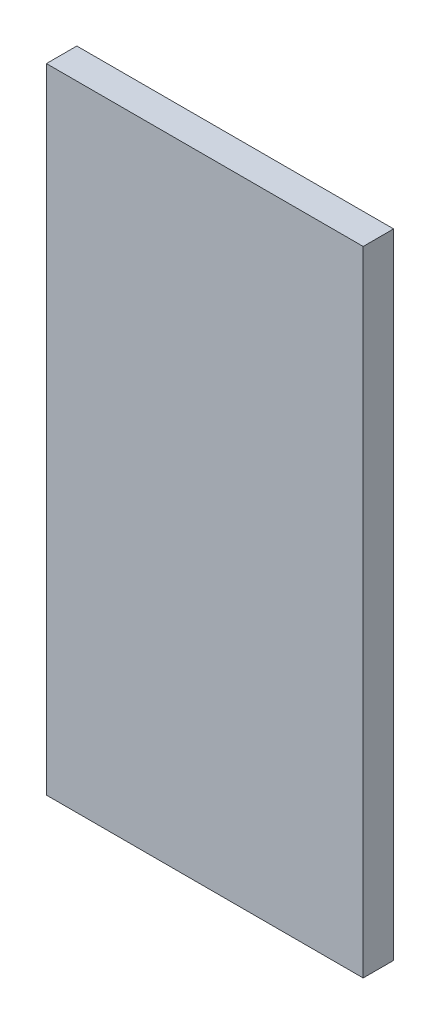
ISO-10303-21;
HEADER;
FILE_DESCRIPTION(('STEP AP214'),'2;1');
FILE_NAME('part.step','',(''),(''),'','','');
FILE_SCHEMA(('AUTOMOTIVE_DESIGN { 1 0 10303 214 1 1 1 1 }'));
ENDSEC;
DATA;
#1=APPLICATION_CONTEXT('core data for automotive mechanical design processes');
#2=APPLICATION_PROTOCOL_DEFINITION('international standard','automotive_design',2000,#1);
#3=PRODUCT_CONTEXT('',#1,'mechanical');
#4=PRODUCT('Part','Part','',(#3));
#5=PRODUCT_RELATED_PRODUCT_CATEGORY('part','',(#4));
#6=PRODUCT_DEFINITION_FORMATION('','',#4);
#7=PRODUCT_DEFINITION_CONTEXT('part definition',#1,'design');
#8=PRODUCT_DEFINITION('design','',#6,#7);
#9=PRODUCT_DEFINITION_SHAPE('','',#8);
#10=(LENGTH_UNIT() NAMED_UNIT(*) SI_UNIT(.MILLI.,.METRE.));
#11=(NAMED_UNIT(*) PLANE_ANGLE_UNIT() SI_UNIT($,.RADIAN.));
#12=(NAMED_UNIT(*) SI_UNIT($,.STERADIAN.) SOLID_ANGLE_UNIT());
#13=UNCERTAINTY_MEASURE_WITH_UNIT(LENGTH_MEASURE(1.E-05),#10,'distance_accuracy_value','');
#14=(GEOMETRIC_REPRESENTATION_CONTEXT(3) GLOBAL_UNCERTAINTY_ASSIGNED_CONTEXT((#13)) GLOBAL_UNIT_ASSIGNED_CONTEXT((#10,
#11,#12)) REPRESENTATION_CONTEXT('',''));
#15=CARTESIAN_POINT('',(0.,0.,0.));
#16=DIRECTION('',(0.,0.,1.));
#17=DIRECTION('',(1.,0.,0.));
#18=AXIS2_PLACEMENT_3D('',#15,#16,#17);
#19=CARTESIAN_POINT('',(25.,50.,4.8));
#20=DIRECTION('',(-1.,0.,0.));
#21=DIRECTION('',(0.,-1.,0.));
#22=AXIS2_PLACEMENT_3D('',#19,#20,#21);
#23=PLANE('',#22);
#24=DIRECTION('',(0.,1.,0.));
#25=VECTOR('',#24,1.);
#26=CARTESIAN_POINT('',(25.,50.,0.));
#27=LINE('',#26,#25);
#28=CARTESIAN_POINT('',(25.,-50.,0.));
#29=VERTEX_POINT('',#28);
#30=CARTESIAN_POINT('',(25.,50.,0.));
#31=VERTEX_POINT('',#30);
#32=EDGE_CURVE('E96',#29,#31,#27,.T.);
#33=ORIENTED_EDGE('',*,*,#32,.T.);
#34=DIRECTION('',(0.,0.,-1.));
#35=VECTOR('',#34,1.);
#36=CARTESIAN_POINT('',(25.,50.,4.8));
#37=LINE('',#36,#35);
#38=CARTESIAN_POINT('',(25.,50.,4.8));
#39=VERTEX_POINT('',#38);
#40=EDGE_CURVE('E11',#39,#31,#37,.T.);
#41=ORIENTED_EDGE('',*,*,#40,.F.);
#42=DIRECTION('',(0.,1.,0.));
#43=VECTOR('',#42,1.);
#44=CARTESIAN_POINT('',(25.,50.,4.8));
#45=LINE('',#44,#43);
#46=CARTESIAN_POINT('',(25.,-50.,4.8));
#47=VERTEX_POINT('',#46);
#48=EDGE_CURVE('E84',#47,#39,#45,.T.);
#49=ORIENTED_EDGE('',*,*,#48,.F.);
#50=DIRECTION('',(0.,0.,-1.));
#51=VECTOR('',#50,1.);
#52=CARTESIAN_POINT('',(25.,-50.,4.8));
#53=LINE('',#52,#51);
#54=EDGE_CURVE('E92',#47,#29,#53,.T.);
#55=ORIENTED_EDGE('',*,*,#54,.T.);
#56=EDGE_LOOP('',(#33,#41,#49,#55));
#57=FACE_BOUND('',#56,.T.);
#58=ADVANCED_FACE('F33',(#57),#23,.F.);
#59=CARTESIAN_POINT('',(-25.,50.,4.8));
#60=DIRECTION('',(0.,-1.,0.));
#61=DIRECTION('',(0.,0.,-1.));
#62=AXIS2_PLACEMENT_3D('',#59,#60,#61);
#63=PLANE('',#62);
#64=DIRECTION('',(-1.,0.,0.));
#65=VECTOR('',#64,1.);
#66=CARTESIAN_POINT('',(-25.,50.,0.));
#67=LINE('',#66,#65);
#68=CARTESIAN_POINT('',(-25.,50.,0.));
#69=VERTEX_POINT('',#68);
#70=EDGE_CURVE('E88',#31,#69,#67,.T.);
#71=ORIENTED_EDGE('',*,*,#70,.T.);
#72=DIRECTION('',(0.,0.,-1.));
#73=VECTOR('',#72,1.);
#74=CARTESIAN_POINT('',(-25.,50.,4.8));
#75=LINE('',#74,#73);
#76=CARTESIAN_POINT('',(-25.,50.,4.8));
#77=VERTEX_POINT('',#76);
#78=EDGE_CURVE('E41',#77,#69,#75,.T.);
#79=ORIENTED_EDGE('',*,*,#78,.F.);
#80=DIRECTION('',(-1.,0.,0.));
#81=VECTOR('',#80,1.);
#82=CARTESIAN_POINT('',(-25.,50.,4.8));
#83=LINE('',#82,#81);
#84=EDGE_CURVE('E79',#39,#77,#83,.T.);
#85=ORIENTED_EDGE('',*,*,#84,.F.);
#86=ORIENTED_EDGE('',*,*,#40,.T.);
#87=EDGE_LOOP('',(#71,#79,#85,#86));
#88=FACE_BOUND('',#87,.T.);
#89=ADVANCED_FACE('F87',(#88),#63,.F.);
#90=CARTESIAN_POINT('',(-25.,50.,4.8));
#91=DIRECTION('',(1.,0.,0.));
#92=DIRECTION('',(0.,1.,0.));
#93=AXIS2_PLACEMENT_3D('',#90,#91,#92);
#94=PLANE('',#93);
#95=DIRECTION('',(0.,-1.,0.));
#96=VECTOR('',#95,1.);
#97=CARTESIAN_POINT('',(-25.,50.,0.));
#98=LINE('',#97,#96);
#99=CARTESIAN_POINT('',(-25.,-50.,0.));
#100=VERTEX_POINT('',#99);
#101=EDGE_CURVE('E66',#69,#100,#98,.T.);
#102=ORIENTED_EDGE('',*,*,#101,.T.);
#103=DIRECTION('',(0.,0.,-1.));
#104=VECTOR('',#103,1.);
#105=CARTESIAN_POINT('',(-25.,-50.,4.8));
#106=LINE('',#105,#104);
#107=CARTESIAN_POINT('',(-25.,-50.,4.8));
#108=VERTEX_POINT('',#107);
#109=EDGE_CURVE('E89',#108,#100,#106,.T.);
#110=ORIENTED_EDGE('',*,*,#109,.F.);
#111=DIRECTION('',(0.,-1.,0.));
#112=VECTOR('',#111,1.);
#113=CARTESIAN_POINT('',(-25.,50.,4.8));
#114=LINE('',#113,#112);
#115=EDGE_CURVE('E82',#77,#108,#114,.T.);
#116=ORIENTED_EDGE('',*,*,#115,.F.);
#117=ORIENTED_EDGE('',*,*,#78,.T.);
#118=EDGE_LOOP('',(#102,#110,#116,#117));
#119=FACE_BOUND('',#118,.T.);
#120=ADVANCED_FACE('F90',(#119),#94,.F.);
#121=CARTESIAN_POINT('',(-25.,-50.,4.8));
#122=DIRECTION('',(0.,1.,0.));
#123=DIRECTION('',(0.,0.,1.));
#124=AXIS2_PLACEMENT_3D('',#121,#122,#123);
#125=PLANE('',#124);
#126=DIRECTION('',(1.,0.,0.));
#127=VECTOR('',#126,1.);
#128=CARTESIAN_POINT('',(-25.,-50.,0.));
#129=LINE('',#128,#127);
#130=EDGE_CURVE('E72',#100,#29,#129,.T.);
#131=ORIENTED_EDGE('',*,*,#130,.T.);
#132=ORIENTED_EDGE('',*,*,#54,.F.);
#133=DIRECTION('',(1.,0.,0.));
#134=VECTOR('',#133,1.);
#135=CARTESIAN_POINT('',(-25.,-50.,4.8));
#136=LINE('',#135,#134);
#137=EDGE_CURVE('E49',#108,#47,#136,.T.);
#138=ORIENTED_EDGE('',*,*,#137,.F.);
#139=ORIENTED_EDGE('',*,*,#109,.T.);
#140=EDGE_LOOP('',(#131,#132,#138,#139));
#141=FACE_BOUND('',#140,.T.);
#142=ADVANCED_FACE('F103',(#141),#125,.F.);
#143=CARTESIAN_POINT('',(0.,0.,4.8));
#144=DIRECTION('',(0.,0.,1.));
#145=DIRECTION('',(1.,0.,0.));
#146=AXIS2_PLACEMENT_3D('',#143,#144,#145);
#147=PLANE('',#146);
#148=ORIENTED_EDGE('',*,*,#48,.T.);
#149=ORIENTED_EDGE('',*,*,#84,.T.);
#150=ORIENTED_EDGE('',*,*,#115,.T.);
#151=ORIENTED_EDGE('',*,*,#137,.T.);
#152=EDGE_LOOP('',(#148,#149,#150,#151));
#153=FACE_BOUND('',#152,.T.);
#154=ADVANCED_FACE('F80',(#153),#147,.T.);
#155=CARTESIAN_POINT('',(0.,0.,0.));
#156=DIRECTION('',(0.,0.,1.));
#157=DIRECTION('',(1.,0.,0.));
#158=AXIS2_PLACEMENT_3D('',#155,#156,#157);
#159=PLANE('',#158);
#160=ORIENTED_EDGE('',*,*,#32,.F.);
#161=ORIENTED_EDGE('',*,*,#130,.F.);
#162=ORIENTED_EDGE('',*,*,#101,.F.);
#163=ORIENTED_EDGE('',*,*,#70,.F.);
#164=EDGE_LOOP('',(#160,#161,#162,#163));
#165=FACE_BOUND('',#164,.T.);
#166=ADVANCED_FACE('F106',(#165),#159,.F.);
#167=CLOSED_SHELL('',(#58,#89,#120,#142,#154,#166));
#168=MANIFOLD_SOLID_BREP('B2',#167);
#169=ADVANCED_BREP_SHAPE_REPRESENTATION('',(#18,#168),#14);
#170=SHAPE_DEFINITION_REPRESENTATION(#9,#169);
ENDSEC;
END-ISO-10303-21;
